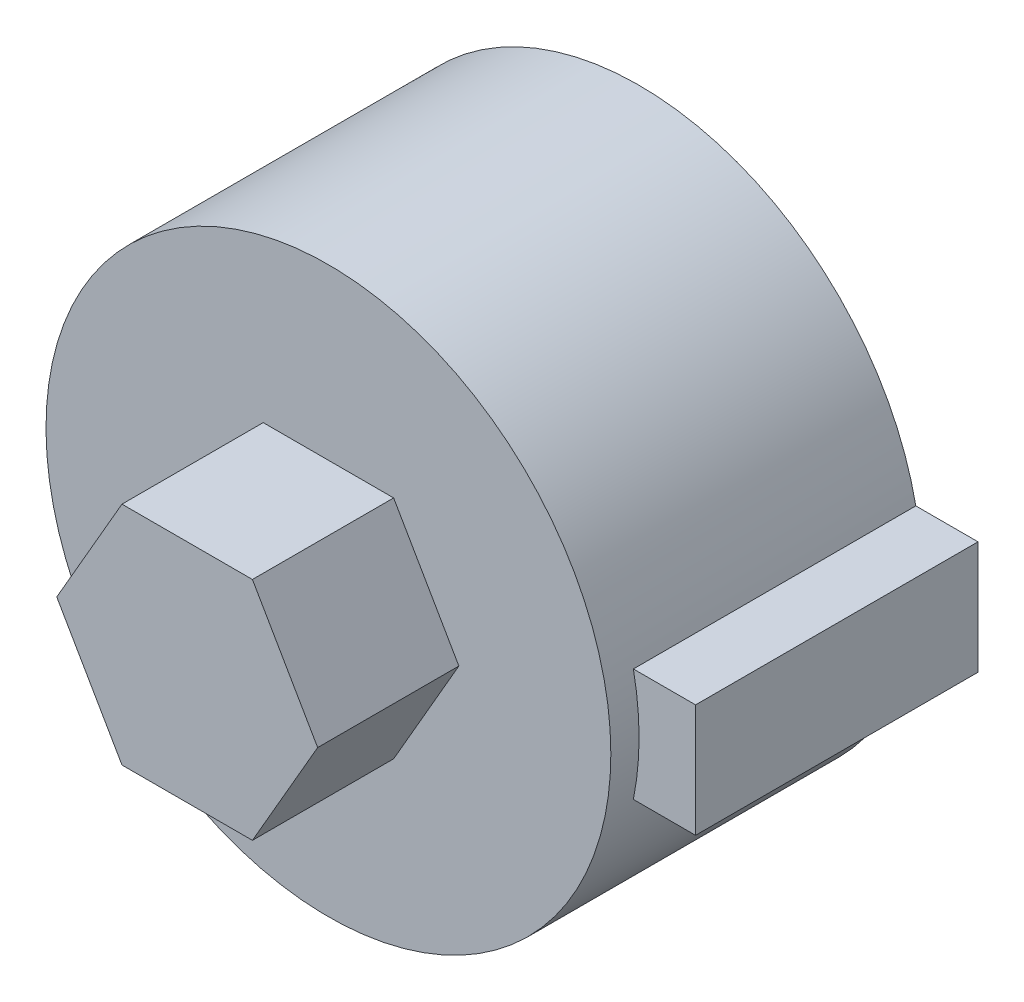
ISO-10303-21;
HEADER;
FILE_DESCRIPTION(('STEP AP214'),'2;1');
FILE_NAME('part.step','',(''),(''),'','','');
FILE_SCHEMA(('AUTOMOTIVE_DESIGN { 1 0 10303 214 1 1 1 1 }'));
ENDSEC;
DATA;
#1=APPLICATION_CONTEXT('core data for automotive mechanical design processes');
#2=APPLICATION_PROTOCOL_DEFINITION('international standard','automotive_design',2000,#1);
#3=PRODUCT_CONTEXT('',#1,'mechanical');
#4=PRODUCT('Part','Part','',(#3));
#5=PRODUCT_RELATED_PRODUCT_CATEGORY('part','',(#4));
#6=PRODUCT_DEFINITION_FORMATION('','',#4);
#7=PRODUCT_DEFINITION_CONTEXT('part definition',#1,'design');
#8=PRODUCT_DEFINITION('design','',#6,#7);
#9=PRODUCT_DEFINITION_SHAPE('','',#8);
#10=(LENGTH_UNIT() NAMED_UNIT(*) SI_UNIT(.MILLI.,.METRE.));
#11=(NAMED_UNIT(*) PLANE_ANGLE_UNIT() SI_UNIT($,.RADIAN.));
#12=(NAMED_UNIT(*) SI_UNIT($,.STERADIAN.) SOLID_ANGLE_UNIT());
#13=UNCERTAINTY_MEASURE_WITH_UNIT(LENGTH_MEASURE(1.E-05),#10,'distance_accuracy_value','');
#14=(GEOMETRIC_REPRESENTATION_CONTEXT(3) GLOBAL_UNCERTAINTY_ASSIGNED_CONTEXT((#13)) GLOBAL_UNIT_ASSIGNED_CONTEXT((#10,
#11,#12)) REPRESENTATION_CONTEXT('',''));
#15=CARTESIAN_POINT('',(0.,0.,0.));
#16=DIRECTION('',(0.,0.,1.));
#17=DIRECTION('',(1.,0.,0.));
#18=AXIS2_PLACEMENT_3D('',#15,#16,#17);
#19=CARTESIAN_POINT('',(0.,0.,10.));
#20=DIRECTION('',(0.,0.,1.));
#21=DIRECTION('',(1.,0.,0.));
#22=AXIS2_PLACEMENT_3D('',#19,#20,#21);
#23=PLANE('',#22);
#24=CARTESIAN_POINT('',(0.,0.,10.));
#25=DIRECTION('',(0.,0.,1.));
#26=DIRECTION('',(1.,0.,0.));
#27=AXIS2_PLACEMENT_3D('',#24,#25,#26);
#28=CIRCLE('',#27,10.);
#29=CARTESIAN_POINT('',(9.79795897113271,-2.,10.));
#30=VERTEX_POINT('',#29);
#31=CARTESIAN_POINT('',(9.79795897113271,2.,10.));
#32=VERTEX_POINT('',#31);
#33=EDGE_CURVE('E11',#30,#32,#28,.T.);
#34=ORIENTED_EDGE('',*,*,#33,.F.);
#35=DIRECTION('',(1.,0.,0.));
#36=VECTOR('',#35,1.);
#37=CARTESIAN_POINT('',(12.,-2.,10.));
#38=LINE('',#37,#36);
#39=CARTESIAN_POINT('',(12.,-2.,10.));
#40=VERTEX_POINT('',#39);
#41=EDGE_CURVE('E151',#30,#40,#38,.T.);
#42=ORIENTED_EDGE('',*,*,#41,.T.);
#43=DIRECTION('',(0.,1.,0.));
#44=VECTOR('',#43,1.);
#45=CARTESIAN_POINT('',(12.,2.,10.));
#46=LINE('',#45,#44);
#47=CARTESIAN_POINT('',(12.,2.,10.));
#48=VERTEX_POINT('',#47);
#49=EDGE_CURVE('E154',#40,#48,#46,.T.);
#50=ORIENTED_EDGE('',*,*,#49,.T.);
#51=DIRECTION('',(-1.,0.,0.));
#52=VECTOR('',#51,1.);
#53=CARTESIAN_POINT('',(12.,2.,10.));
#54=LINE('',#53,#52);
#55=EDGE_CURVE('E148',#48,#32,#54,.T.);
#56=ORIENTED_EDGE('',*,*,#55,.T.);
#57=EDGE_LOOP('',(#34,#42,#50,#56));
#58=FACE_BOUND('',#57,.T.);
#59=ADVANCED_FACE('F35',(#58),#23,.T.);
#60=CARTESIAN_POINT('',(0.,0.,0.));
#61=DIRECTION('',(0.,0.,1.));
#62=DIRECTION('',(1.,0.,0.));
#63=AXIS2_PLACEMENT_3D('',#60,#61,#62);
#64=PLANE('',#63);
#65=DIRECTION('',(-1.,0.,0.));
#66=VECTOR('',#65,1.);
#67=CARTESIAN_POINT('',(12.,2.,0.));
#68=LINE('',#67,#66);
#69=CARTESIAN_POINT('',(12.,2.,0.));
#70=VERTEX_POINT('',#69);
#71=CARTESIAN_POINT('',(9.79795897113271,2.,0.));
#72=VERTEX_POINT('',#71);
#73=EDGE_CURVE('E147',#70,#72,#68,.T.);
#74=ORIENTED_EDGE('',*,*,#73,.F.);
#75=DIRECTION('',(0.,1.,0.));
#76=VECTOR('',#75,1.);
#77=CARTESIAN_POINT('',(12.,2.,0.));
#78=LINE('',#77,#76);
#79=CARTESIAN_POINT('',(12.,-2.,0.));
#80=VERTEX_POINT('',#79);
#81=EDGE_CURVE('E152',#80,#70,#78,.T.);
#82=ORIENTED_EDGE('',*,*,#81,.F.);
#83=DIRECTION('',(1.,0.,0.));
#84=VECTOR('',#83,1.);
#85=CARTESIAN_POINT('',(12.,-2.,0.));
#86=LINE('',#85,#84);
#87=CARTESIAN_POINT('',(9.79795897113271,-2.,0.));
#88=VERTEX_POINT('',#87);
#89=EDGE_CURVE('E161',#88,#80,#86,.T.);
#90=ORIENTED_EDGE('',*,*,#89,.F.);
#91=CARTESIAN_POINT('',(0.,0.,0.));
#92=DIRECTION('',(0.,0.,1.));
#93=DIRECTION('',(1.,0.,0.));
#94=AXIS2_PLACEMENT_3D('',#91,#92,#93);
#95=CIRCLE('',#94,10.);
#96=EDGE_CURVE('E159',#72,#88,#95,.T.);
#97=ORIENTED_EDGE('',*,*,#96,.F.);
#98=EDGE_LOOP('',(#74,#82,#90,#97));
#99=FACE_BOUND('',#98,.T.);
#100=CARTESIAN_POINT('',(0.,0.,0.));
#101=DIRECTION('',(0.,0.,1.));
#102=DIRECTION('',(1.,0.,0.));
#103=AXIS2_PLACEMENT_3D('',#100,#101,#102);
#104=CIRCLE('',#103,5.);
#105=CARTESIAN_POINT('',(5.,0.,0.));
#106=VERTEX_POINT('',#105);
#107=EDGE_CURVE('E144',#106,#106,#104,.T.);
#108=ORIENTED_EDGE('',*,*,#107,.T.);
#109=EDGE_LOOP('',(#108));
#110=FACE_BOUND('',#109,.T.);
#111=ADVANCED_FACE('F184',(#99,#110),#64,.F.);
#112=CARTESIAN_POINT('',(12.,2.,10.));
#113=DIRECTION('',(0.,-1.,0.));
#114=DIRECTION('',(0.,0.,-1.));
#115=AXIS2_PLACEMENT_3D('',#112,#113,#114);
#116=PLANE('',#115);
#117=ORIENTED_EDGE('',*,*,#73,.T.);
#118=DIRECTION('',(0.,0.,-1.));
#119=VECTOR('',#118,1.);
#120=CARTESIAN_POINT('',(9.79795897113271,2.,10.));
#121=LINE('',#120,#119);
#122=EDGE_CURVE('E39',#32,#72,#121,.T.);
#123=ORIENTED_EDGE('',*,*,#122,.F.);
#124=ORIENTED_EDGE('',*,*,#55,.F.);
#125=DIRECTION('',(0.,0.,-1.));
#126=VECTOR('',#125,1.);
#127=CARTESIAN_POINT('',(12.,2.,10.));
#128=LINE('',#127,#126);
#129=EDGE_CURVE('E156',#48,#70,#128,.T.);
#130=ORIENTED_EDGE('',*,*,#129,.T.);
#131=EDGE_LOOP('',(#117,#123,#124,#130));
#132=FACE_BOUND('',#131,.T.);
#133=ADVANCED_FACE('F37',(#132),#116,.F.);
#134=CARTESIAN_POINT('',(0.,0.,10.));
#135=DIRECTION('',(0.,0.,-1.));
#136=DIRECTION('',(-1.,0.,0.));
#137=AXIS2_PLACEMENT_3D('',#134,#135,#136);
#138=CYLINDRICAL_SURFACE('',#137,10.);
#139=ORIENTED_EDGE('',*,*,#96,.T.);
#140=DIRECTION('',(0.,0.,-1.));
#141=VECTOR('',#140,1.);
#142=CARTESIAN_POINT('',(9.79795897113271,-2.,10.));
#143=LINE('',#142,#141);
#144=EDGE_CURVE('E168',#30,#88,#143,.T.);
#145=ORIENTED_EDGE('',*,*,#144,.F.);
#146=ORIENTED_EDGE('',*,*,#33,.T.);
#147=ORIENTED_EDGE('',*,*,#122,.T.);
#148=EDGE_LOOP('',(#139,#145,#146,#147));
#149=FACE_BOUND('',#148,.T.);
#150=CARTESIAN_POINT('',(0.,0.,11.));
#151=DIRECTION('',(0.,0.,1.));
#152=DIRECTION('',(1.,0.,0.));
#153=AXIS2_PLACEMENT_3D('',#150,#151,#152);
#154=CIRCLE('',#153,10.);
#155=CARTESIAN_POINT('',(10.,0.,11.));
#156=VERTEX_POINT('',#155);
#157=EDGE_CURVE('E133',#156,#156,#154,.T.);
#158=ORIENTED_EDGE('',*,*,#157,.F.);
#159=EDGE_LOOP('',(#158));
#160=FACE_BOUND('',#159,.T.);
#161=ADVANCED_FACE('F176',(#149,#160),#138,.T.);
#162=CARTESIAN_POINT('',(12.,-2.,10.));
#163=DIRECTION('',(0.,1.,0.));
#164=DIRECTION('',(0.,0.,1.));
#165=AXIS2_PLACEMENT_3D('',#162,#163,#164);
#166=PLANE('',#165);
#167=ORIENTED_EDGE('',*,*,#89,.T.);
#168=DIRECTION('',(0.,0.,-1.));
#169=VECTOR('',#168,1.);
#170=CARTESIAN_POINT('',(12.,-2.,10.));
#171=LINE('',#170,#169);
#172=EDGE_CURVE('E166',#40,#80,#171,.T.);
#173=ORIENTED_EDGE('',*,*,#172,.F.);
#174=ORIENTED_EDGE('',*,*,#41,.F.);
#175=ORIENTED_EDGE('',*,*,#144,.T.);
#176=EDGE_LOOP('',(#167,#173,#174,#175));
#177=FACE_BOUND('',#176,.T.);
#178=ADVANCED_FACE('F187',(#177),#166,.F.);
#179=CARTESIAN_POINT('',(12.,2.,10.));
#180=DIRECTION('',(-1.,0.,0.));
#181=DIRECTION('',(0.,0.,1.));
#182=AXIS2_PLACEMENT_3D('',#179,#180,#181);
#183=PLANE('',#182);
#184=ORIENTED_EDGE('',*,*,#81,.T.);
#185=ORIENTED_EDGE('',*,*,#129,.F.);
#186=ORIENTED_EDGE('',*,*,#49,.F.);
#187=ORIENTED_EDGE('',*,*,#172,.T.);
#188=EDGE_LOOP('',(#184,#185,#186,#187));
#189=FACE_BOUND('',#188,.T.);
#190=ADVANCED_FACE('F190',(#189),#183,.F.);
#191=CARTESIAN_POINT('',(0.,0.,10.));
#192=DIRECTION('',(0.,0.,-1.));
#193=DIRECTION('',(-1.,0.,0.));
#194=AXIS2_PLACEMENT_3D('',#191,#192,#193);
#195=CYLINDRICAL_SURFACE('',#194,5.);
#196=CARTESIAN_POINT('',(0.,0.,10.));
#197=DIRECTION('',(0.,0.,1.));
#198=DIRECTION('',(1.,0.,0.));
#199=AXIS2_PLACEMENT_3D('',#196,#197,#198);
#200=CIRCLE('',#199,5.);
#201=CARTESIAN_POINT('',(5.,0.,10.));
#202=VERTEX_POINT('',#201);
#203=EDGE_CURVE('E136',#202,#202,#200,.T.);
#204=ORIENTED_EDGE('',*,*,#203,.T.);
#205=EDGE_LOOP('',(#204));
#206=FACE_BOUND('',#205,.T.);
#207=ORIENTED_EDGE('',*,*,#107,.F.);
#208=EDGE_LOOP('',(#207));
#209=FACE_BOUND('',#208,.T.);
#210=ADVANCED_FACE('F201',(#206,#209),#195,.F.);
#211=CARTESIAN_POINT('',(0.,0.,11.));
#212=DIRECTION('',(0.,0.,1.));
#213=DIRECTION('',(1.,0.,0.));
#214=AXIS2_PLACEMENT_3D('',#211,#212,#213);
#215=PLANE('',#214);
#216=DIRECTION('',(0.5,0.866025403784439,0.));
#217=VECTOR('',#216,1.);
#218=CARTESIAN_POINT('',(2.30940107675851,-4.,11.));
#219=LINE('',#218,#217);
#220=CARTESIAN_POINT('',(2.30940107675851,-4.,11.));
#221=VERTEX_POINT('',#220);
#222=CARTESIAN_POINT('',(4.61880215351701,0.,11.));
#223=VERTEX_POINT('',#222);
#224=EDGE_CURVE('E51',#221,#223,#219,.T.);
#225=ORIENTED_EDGE('',*,*,#224,.F.);
#226=DIRECTION('',(1.,0.,0.));
#227=VECTOR('',#226,1.);
#228=CARTESIAN_POINT('',(-2.3094010767585,-4.,11.));
#229=LINE('',#228,#227);
#230=CARTESIAN_POINT('',(-2.3094010767585,-4.,11.));
#231=VERTEX_POINT('',#230);
#232=EDGE_CURVE('E55',#231,#221,#229,.T.);
#233=ORIENTED_EDGE('',*,*,#232,.F.);
#234=DIRECTION('',(0.5,-0.866025403784438,0.));
#235=VECTOR('',#234,1.);
#236=CARTESIAN_POINT('',(-4.61880215351701,0.,11.));
#237=LINE('',#236,#235);
#238=CARTESIAN_POINT('',(-4.61880215351701,0.,11.));
#239=VERTEX_POINT('',#238);
#240=EDGE_CURVE('E328',#239,#231,#237,.T.);
#241=ORIENTED_EDGE('',*,*,#240,.F.);
#242=DIRECTION('',(-0.5,-0.866025403784439,0.));
#243=VECTOR('',#242,1.);
#244=CARTESIAN_POINT('',(-2.3094010767585,4.,11.));
#245=LINE('',#244,#243);
#246=CARTESIAN_POINT('',(-2.3094010767585,4.,11.));
#247=VERTEX_POINT('',#246);
#248=EDGE_CURVE('E343',#247,#239,#245,.T.);
#249=ORIENTED_EDGE('',*,*,#248,.F.);
#250=DIRECTION('',(-1.,0.,0.));
#251=VECTOR('',#250,1.);
#252=CARTESIAN_POINT('',(2.3094010767585,4.,11.));
#253=LINE('',#252,#251);
#254=CARTESIAN_POINT('',(2.3094010767585,4.,11.));
#255=VERTEX_POINT('',#254);
#256=EDGE_CURVE('E346',#255,#247,#253,.T.);
#257=ORIENTED_EDGE('',*,*,#256,.F.);
#258=DIRECTION('',(-0.5,0.866025403784439,0.));
#259=VECTOR('',#258,1.);
#260=CARTESIAN_POINT('',(4.61880215351701,0.,11.));
#261=LINE('',#260,#259);
#262=EDGE_CURVE('E347',#223,#255,#261,.T.);
#263=ORIENTED_EDGE('',*,*,#262,.F.);
#264=EDGE_LOOP('',(#225,#233,#241,#249,#257,#263));
#265=FACE_BOUND('',#264,.T.);
#266=ORIENTED_EDGE('',*,*,#157,.T.);
#267=EDGE_LOOP('',(#266));
#268=FACE_BOUND('',#267,.T.);
#269=ADVANCED_FACE('F231',(#265,#268),#215,.T.);
#270=CARTESIAN_POINT('',(0.,0.,10.));
#271=DIRECTION('',(0.,0.,1.));
#272=DIRECTION('',(1.,0.,0.));
#273=AXIS2_PLACEMENT_3D('',#270,#271,#272);
#274=PLANE('',#273);
#275=ORIENTED_EDGE('',*,*,#203,.F.);
#276=EDGE_LOOP('',(#275));
#277=FACE_BOUND('',#276,.T.);
#278=ADVANCED_FACE('F250',(#277),#274,.F.);
#279=CARTESIAN_POINT('',(2.30940107675851,-4.,16.));
#280=DIRECTION('',(-0.866025403784439,0.5,0.));
#281=DIRECTION('',(-0.5,-0.866025403784439,0.));
#282=AXIS2_PLACEMENT_3D('',#279,#280,#281);
#283=PLANE('',#282);
#284=ORIENTED_EDGE('',*,*,#224,.T.);
#285=DIRECTION('',(0.,0.,-1.));
#286=VECTOR('',#285,1.);
#287=CARTESIAN_POINT('',(4.61880215351701,0.,16.));
#288=LINE('',#287,#286);
#289=CARTESIAN_POINT('',(4.61880215351701,0.,16.));
#290=VERTEX_POINT('',#289);
#291=EDGE_CURVE('E116',#290,#223,#288,.T.);
#292=ORIENTED_EDGE('',*,*,#291,.F.);
#293=DIRECTION('',(0.5,0.866025403784439,0.));
#294=VECTOR('',#293,1.);
#295=CARTESIAN_POINT('',(2.30940107675851,-4.,16.));
#296=LINE('',#295,#294);
#297=CARTESIAN_POINT('',(2.30940107675851,-4.,16.));
#298=VERTEX_POINT('',#297);
#299=EDGE_CURVE('E122',#298,#290,#296,.T.);
#300=ORIENTED_EDGE('',*,*,#299,.F.);
#301=DIRECTION('',(0.,0.,-1.));
#302=VECTOR('',#301,1.);
#303=CARTESIAN_POINT('',(2.30940107675851,-4.,16.));
#304=LINE('',#303,#302);
#305=EDGE_CURVE('E325',#298,#221,#304,.T.);
#306=ORIENTED_EDGE('',*,*,#305,.T.);
#307=EDGE_LOOP('',(#284,#292,#300,#306));
#308=FACE_BOUND('',#307,.T.);
#309=ADVANCED_FACE('F132',(#308),#283,.F.);
#310=CARTESIAN_POINT('',(4.61880215351701,0.,16.));
#311=DIRECTION('',(-0.866025403784439,-0.5,0.));
#312=DIRECTION('',(0.5,-0.866025403784439,0.));
#313=AXIS2_PLACEMENT_3D('',#310,#311,#312);
#314=PLANE('',#313);
#315=ORIENTED_EDGE('',*,*,#262,.T.);
#316=DIRECTION('',(0.,0.,-1.));
#317=VECTOR('',#316,1.);
#318=CARTESIAN_POINT('',(2.3094010767585,4.,16.));
#319=LINE('',#318,#317);
#320=CARTESIAN_POINT('',(2.3094010767585,4.,16.));
#321=VERTEX_POINT('',#320);
#322=EDGE_CURVE('E118',#321,#255,#319,.T.);
#323=ORIENTED_EDGE('',*,*,#322,.F.);
#324=DIRECTION('',(-0.5,0.866025403784439,0.));
#325=VECTOR('',#324,1.);
#326=CARTESIAN_POINT('',(4.61880215351701,0.,16.));
#327=LINE('',#326,#325);
#328=EDGE_CURVE('E111',#290,#321,#327,.T.);
#329=ORIENTED_EDGE('',*,*,#328,.F.);
#330=ORIENTED_EDGE('',*,*,#291,.T.);
#331=EDGE_LOOP('',(#315,#323,#329,#330));
#332=FACE_BOUND('',#331,.T.);
#333=ADVANCED_FACE('F114',(#332),#314,.F.);
#334=CARTESIAN_POINT('',(2.3094010767585,4.,16.));
#335=DIRECTION('',(0.,-1.,0.));
#336=DIRECTION('',(0.,0.,-1.));
#337=AXIS2_PLACEMENT_3D('',#334,#335,#336);
#338=PLANE('',#337);
#339=ORIENTED_EDGE('',*,*,#256,.T.);
#340=DIRECTION('',(0.,0.,-1.));
#341=VECTOR('',#340,1.);
#342=CARTESIAN_POINT('',(-2.3094010767585,4.,16.));
#343=LINE('',#342,#341);
#344=CARTESIAN_POINT('',(-2.3094010767585,4.,16.));
#345=VERTEX_POINT('',#344);
#346=EDGE_CURVE('E138',#345,#247,#343,.T.);
#347=ORIENTED_EDGE('',*,*,#346,.F.);
#348=DIRECTION('',(-1.,0.,0.));
#349=VECTOR('',#348,1.);
#350=CARTESIAN_POINT('',(2.3094010767585,4.,16.));
#351=LINE('',#350,#349);
#352=EDGE_CURVE('E121',#321,#345,#351,.T.);
#353=ORIENTED_EDGE('',*,*,#352,.F.);
#354=ORIENTED_EDGE('',*,*,#322,.T.);
#355=EDGE_LOOP('',(#339,#347,#353,#354));
#356=FACE_BOUND('',#355,.T.);
#357=ADVANCED_FACE('F271',(#356),#338,.F.);
#358=CARTESIAN_POINT('',(-2.3094010767585,4.,16.));
#359=DIRECTION('',(0.866025403784439,-0.5,0.));
#360=DIRECTION('',(0.5,0.866025403784439,0.));
#361=AXIS2_PLACEMENT_3D('',#358,#359,#360);
#362=PLANE('',#361);
#363=ORIENTED_EDGE('',*,*,#248,.T.);
#364=DIRECTION('',(0.,0.,-1.));
#365=VECTOR('',#364,1.);
#366=CARTESIAN_POINT('',(-4.61880215351701,0.,16.));
#367=LINE('',#366,#365);
#368=CARTESIAN_POINT('',(-4.61880215351701,0.,16.));
#369=VERTEX_POINT('',#368);
#370=EDGE_CURVE('E331',#369,#239,#367,.T.);
#371=ORIENTED_EDGE('',*,*,#370,.F.);
#372=DIRECTION('',(-0.5,-0.866025403784439,0.));
#373=VECTOR('',#372,1.);
#374=CARTESIAN_POINT('',(-2.3094010767585,4.,16.));
#375=LINE('',#374,#373);
#376=EDGE_CURVE('E344',#345,#369,#375,.T.);
#377=ORIENTED_EDGE('',*,*,#376,.F.);
#378=ORIENTED_EDGE('',*,*,#346,.T.);
#379=EDGE_LOOP('',(#363,#371,#377,#378));
#380=FACE_BOUND('',#379,.T.);
#381=ADVANCED_FACE('F279',(#380),#362,.F.);
#382=CARTESIAN_POINT('',(-4.61880215351701,0.,16.));
#383=DIRECTION('',(0.866025403784438,0.5,0.));
#384=DIRECTION('',(-0.5,0.866025403784439,0.));
#385=AXIS2_PLACEMENT_3D('',#382,#383,#384);
#386=PLANE('',#385);
#387=ORIENTED_EDGE('',*,*,#240,.T.);
#388=DIRECTION('',(0.,0.,-1.));
#389=VECTOR('',#388,1.);
#390=CARTESIAN_POINT('',(-2.3094010767585,-4.,16.));
#391=LINE('',#390,#389);
#392=CARTESIAN_POINT('',(-2.3094010767585,-4.,16.));
#393=VERTEX_POINT('',#392);
#394=EDGE_CURVE('E327',#393,#231,#391,.T.);
#395=ORIENTED_EDGE('',*,*,#394,.F.);
#396=DIRECTION('',(0.5,-0.866025403784438,0.));
#397=VECTOR('',#396,1.);
#398=CARTESIAN_POINT('',(-4.61880215351701,0.,16.));
#399=LINE('',#398,#397);
#400=EDGE_CURVE('E333',#369,#393,#399,.T.);
#401=ORIENTED_EDGE('',*,*,#400,.F.);
#402=ORIENTED_EDGE('',*,*,#370,.T.);
#403=EDGE_LOOP('',(#387,#395,#401,#402));
#404=FACE_BOUND('',#403,.T.);
#405=ADVANCED_FACE('F288',(#404),#386,.F.);
#406=CARTESIAN_POINT('',(-2.3094010767585,-4.,16.));
#407=DIRECTION('',(0.,1.,0.));
#408=DIRECTION('',(0.,0.,1.));
#409=AXIS2_PLACEMENT_3D('',#406,#407,#408);
#410=PLANE('',#409);
#411=ORIENTED_EDGE('',*,*,#232,.T.);
#412=ORIENTED_EDGE('',*,*,#305,.F.);
#413=DIRECTION('',(1.,0.,0.));
#414=VECTOR('',#413,1.);
#415=CARTESIAN_POINT('',(-2.3094010767585,-4.,16.));
#416=LINE('',#415,#414);
#417=EDGE_CURVE('E127',#393,#298,#416,.T.);
#418=ORIENTED_EDGE('',*,*,#417,.F.);
#419=ORIENTED_EDGE('',*,*,#394,.T.);
#420=EDGE_LOOP('',(#411,#412,#418,#419));
#421=FACE_BOUND('',#420,.T.);
#422=ADVANCED_FACE('F297',(#421),#410,.F.);
#423=CARTESIAN_POINT('',(0.,0.,16.));
#424=DIRECTION('',(0.,0.,1.));
#425=DIRECTION('',(1.,0.,0.));
#426=AXIS2_PLACEMENT_3D('',#423,#424,#425);
#427=PLANE('',#426);
#428=ORIENTED_EDGE('',*,*,#299,.T.);
#429=ORIENTED_EDGE('',*,*,#328,.T.);
#430=ORIENTED_EDGE('',*,*,#352,.T.);
#431=ORIENTED_EDGE('',*,*,#376,.T.);
#432=ORIENTED_EDGE('',*,*,#400,.T.);
#433=ORIENTED_EDGE('',*,*,#417,.T.);
#434=EDGE_LOOP('',(#428,#429,#430,#431,#432,#433));
#435=FACE_BOUND('',#434,.T.);
#436=ADVANCED_FACE('F125',(#435),#427,.T.);
#437=CLOSED_SHELL('',(#59,#111,#133,#161,#178,#190,#210,#269,#278,#309,#333,#357,#381,#405,#422,#436));
#438=MANIFOLD_SOLID_BREP('B2',#437);
#439=ADVANCED_BREP_SHAPE_REPRESENTATION('',(#18,#438),#14);
#440=SHAPE_DEFINITION_REPRESENTATION(#9,#439);
ENDSEC;
END-ISO-10303-21;
